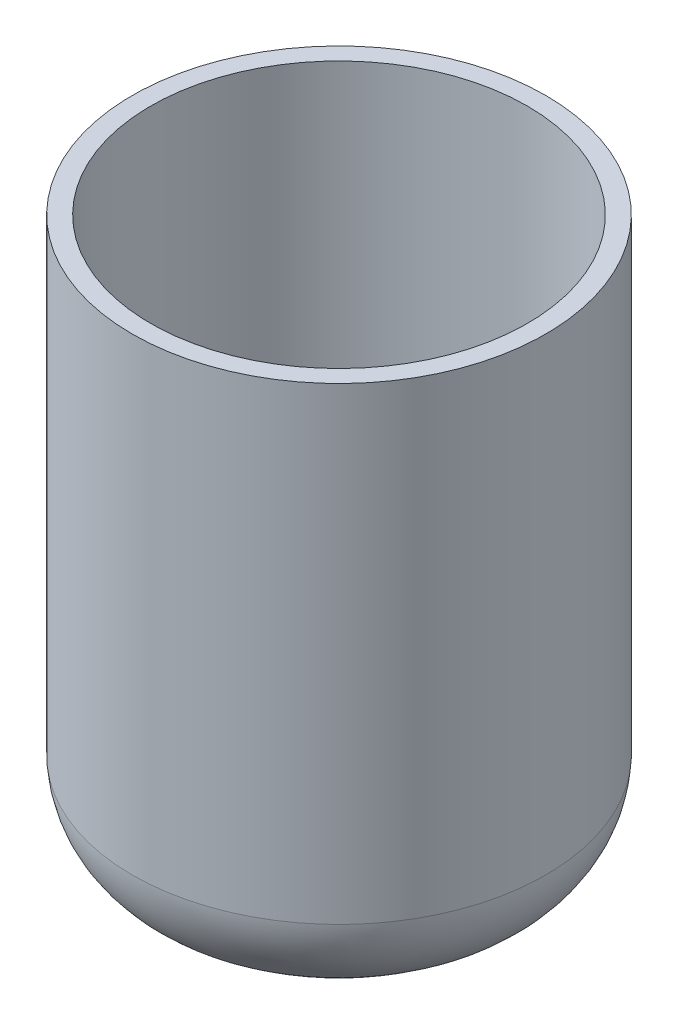
ISO-10303-21;
HEADER;
FILE_DESCRIPTION(('STEP AP214'),'2;1');
FILE_NAME('part.step','',(''),(''),'','','');
FILE_SCHEMA(('AUTOMOTIVE_DESIGN { 1 0 10303 214 1 1 1 1 }'));
ENDSEC;
DATA;
#1=APPLICATION_CONTEXT('core data for automotive mechanical design processes');
#2=APPLICATION_PROTOCOL_DEFINITION('international standard','automotive_design',2000,#1);
#3=PRODUCT_CONTEXT('',#1,'mechanical');
#4=PRODUCT('Part','Part','',(#3));
#5=PRODUCT_RELATED_PRODUCT_CATEGORY('part','',(#4));
#6=PRODUCT_DEFINITION_FORMATION('','',#4);
#7=PRODUCT_DEFINITION_CONTEXT('part definition',#1,'design');
#8=PRODUCT_DEFINITION('design','',#6,#7);
#9=PRODUCT_DEFINITION_SHAPE('','',#8);
#10=(LENGTH_UNIT() NAMED_UNIT(*) SI_UNIT(.MILLI.,.METRE.));
#11=(NAMED_UNIT(*) PLANE_ANGLE_UNIT() SI_UNIT($,.RADIAN.));
#12=(NAMED_UNIT(*) SI_UNIT($,.STERADIAN.) SOLID_ANGLE_UNIT());
#13=UNCERTAINTY_MEASURE_WITH_UNIT(LENGTH_MEASURE(1.E-05),#10,'distance_accuracy_value','');
#14=(GEOMETRIC_REPRESENTATION_CONTEXT(3) GLOBAL_UNCERTAINTY_ASSIGNED_CONTEXT((#13)) GLOBAL_UNIT_ASSIGNED_CONTEXT((#10,
#11,#12)) REPRESENTATION_CONTEXT('',''));
#15=CARTESIAN_POINT('',(0.,0.,0.));
#16=DIRECTION('',(0.,0.,1.));
#17=DIRECTION('',(1.,0.,0.));
#18=AXIS2_PLACEMENT_3D('',#15,#16,#17);
#19=CARTESIAN_POINT('',(145.,-590.,0.));
#20=DIRECTION('',(0.,1.,0.));
#21=DIRECTION('',(0.,0.,1.));
#22=AXIS2_PLACEMENT_3D('',#19,#20,#21);
#23=PLANE('',#22);
#24=CARTESIAN_POINT('',(0.,-590.,0.));
#25=DIRECTION('',(0.,-1.,0.));
#26=DIRECTION('',(0.,0.,-1.));
#27=AXIS2_PLACEMENT_3D('',#24,#25,#26);
#28=CIRCLE('',#27,142.122341448751);
#29=CARTESIAN_POINT('',(0.,-590.,-142.122341448751));
#30=VERTEX_POINT('',#29);
#31=EDGE_CURVE('E10',#30,#30,#28,.T.);
#32=ORIENTED_EDGE('',*,*,#31,.F.);
#33=EDGE_LOOP('',(#32));
#34=FACE_BOUND('',#33,.T.);
#35=ADVANCED_FACE('F34',(#34),#23,.T.);
#36=CARTESIAN_POINT('',(0.,-504.046103199423,0.));
#37=DIRECTION('',(0.,-1.,0.));
#38=DIRECTION('',(0.,0.,-1.));
#39=AXIS2_PLACEMENT_3D('',#36,#37,#38);
#40=TOROIDAL_SURFACE('',#39,115.440369542691,90.);
#41=ORIENTED_EDGE('',*,*,#31,.T.);
#42=EDGE_LOOP('',(#41));
#43=FACE_BOUND('',#42,.T.);
#44=CARTESIAN_POINT('',(0.,-509.896767872913,0.));
#45=DIRECTION('',(0.,-1.,0.));
#46=DIRECTION('',(0.,0.,-1.));
#47=AXIS2_PLACEMENT_3D('',#44,#45,#46);
#48=CIRCLE('',#47,205.25);
#49=CARTESIAN_POINT('',(0.,-509.896767872913,-205.25));
#50=VERTEX_POINT('',#49);
#51=EDGE_CURVE('E40',#50,#50,#48,.T.);
#52=ORIENTED_EDGE('',*,*,#51,.F.);
#53=EDGE_LOOP('',(#52));
#54=FACE_BOUND('',#53,.T.);
#55=ADVANCED_FACE('F82',(#43,#54),#40,.F.);
#56=CARTESIAN_POINT('',(0.,-610.,0.));
#57=DIRECTION('',(0.,-1.,0.));
#58=DIRECTION('',(0.,0.,-1.));
#59=AXIS2_PLACEMENT_3D('',#56,#57,#58);
#60=CYLINDRICAL_SURFACE('',#59,205.25);
#61=ORIENTED_EDGE('',*,*,#51,.T.);
#62=EDGE_LOOP('',(#61));
#63=FACE_BOUND('',#62,.T.);
#64=CARTESIAN_POINT('',(0.,0.,0.));
#65=DIRECTION('',(0.,-1.,0.));
#66=DIRECTION('',(0.,0.,-1.));
#67=AXIS2_PLACEMENT_3D('',#64,#65,#66);
#68=CIRCLE('',#67,205.25);
#69=CARTESIAN_POINT('',(0.,0.,-205.25));
#70=VERTEX_POINT('',#69);
#71=EDGE_CURVE('E44',#70,#70,#68,.T.);
#72=ORIENTED_EDGE('',*,*,#71,.F.);
#73=EDGE_LOOP('',(#72));
#74=FACE_BOUND('',#73,.T.);
#75=ADVANCED_FACE('F77',(#63,#74),#60,.F.);
#76=CARTESIAN_POINT('',(205.25,0.,0.));
#77=DIRECTION('',(0.,-1.,0.));
#78=DIRECTION('',(0.,0.,-1.));
#79=AXIS2_PLACEMENT_3D('',#76,#77,#78);
#80=PLANE('',#79);
#81=CARTESIAN_POINT('',(0.,0.,0.));
#82=DIRECTION('',(0.,-1.,0.));
#83=DIRECTION('',(0.,0.,-1.));
#84=AXIS2_PLACEMENT_3D('',#81,#82,#83);
#85=CIRCLE('',#84,225.25);
#86=CARTESIAN_POINT('',(0.,0.,-225.25));
#87=VERTEX_POINT('',#86);
#88=EDGE_CURVE('E48',#87,#87,#85,.T.);
#89=ORIENTED_EDGE('',*,*,#88,.F.);
#90=EDGE_LOOP('',(#89));
#91=FACE_BOUND('',#90,.T.);
#92=ORIENTED_EDGE('',*,*,#71,.T.);
#93=EDGE_LOOP('',(#92));
#94=FACE_BOUND('',#93,.T.);
#95=ADVANCED_FACE('F71',(#91,#94),#80,.F.);
#96=CARTESIAN_POINT('',(0.,-610.,0.));
#97=DIRECTION('',(0.,-1.,0.));
#98=DIRECTION('',(0.,0.,-1.));
#99=AXIS2_PLACEMENT_3D('',#96,#97,#98);
#100=CYLINDRICAL_SURFACE('',#99,225.25);
#101=CARTESIAN_POINT('',(0.,-510.514878881827,0.));
#102=DIRECTION('',(0.,-1.,0.));
#103=DIRECTION('',(0.,0.,-1.));
#104=AXIS2_PLACEMENT_3D('',#101,#102,#103);
#105=CIRCLE('',#104,225.25);
#106=CARTESIAN_POINT('',(0.,-510.514878881827,-225.25));
#107=VERTEX_POINT('',#106);
#108=EDGE_CURVE('E53',#107,#107,#105,.T.);
#109=ORIENTED_EDGE('',*,*,#108,.F.);
#110=EDGE_LOOP('',(#109));
#111=FACE_BOUND('',#110,.T.);
#112=ORIENTED_EDGE('',*,*,#88,.T.);
#113=EDGE_LOOP('',(#112));
#114=FACE_BOUND('',#113,.T.);
#115=ADVANCED_FACE('F65',(#111,#114),#100,.T.);
#116=CARTESIAN_POINT('',(0.,-504.046103199423,0.));
#117=DIRECTION('',(0.,-1.,0.));
#118=DIRECTION('',(0.,0.,-1.));
#119=AXIS2_PLACEMENT_3D('',#116,#117,#118);
#120=TOROIDAL_SURFACE('',#119,115.440369542691,110.);
#121=CARTESIAN_POINT('',(0.,-610.,0.));
#122=DIRECTION('',(0.,-1.,0.));
#123=DIRECTION('',(0.,0.,-1.));
#124=AXIS2_PLACEMENT_3D('',#121,#122,#123);
#125=CIRCLE('',#124,145.);
#126=CARTESIAN_POINT('',(0.,-610.,-145.));
#127=VERTEX_POINT('',#126);
#128=EDGE_CURVE('E56',#127,#127,#125,.T.);
#129=ORIENTED_EDGE('',*,*,#128,.F.);
#130=EDGE_LOOP('',(#129));
#131=FACE_BOUND('',#130,.T.);
#132=ORIENTED_EDGE('',*,*,#108,.T.);
#133=EDGE_LOOP('',(#132));
#134=FACE_BOUND('',#133,.T.);
#135=ADVANCED_FACE('F62',(#131,#134),#120,.T.);
#136=CARTESIAN_POINT('',(145.,-610.,0.));
#137=DIRECTION('',(0.,1.,0.));
#138=DIRECTION('',(0.,0.,1.));
#139=AXIS2_PLACEMENT_3D('',#136,#137,#138);
#140=PLANE('',#139);
#141=ORIENTED_EDGE('',*,*,#128,.T.);
#142=EDGE_LOOP('',(#141));
#143=FACE_BOUND('',#142,.T.);
#144=ADVANCED_FACE('F60',(#143),#140,.F.);
#145=CLOSED_SHELL('',(#35,#55,#75,#95,#115,#135,#144));
#146=MANIFOLD_SOLID_BREP('B2',#145);
#147=ADVANCED_BREP_SHAPE_REPRESENTATION('',(#18,#146),#14);
#148=SHAPE_DEFINITION_REPRESENTATION(#9,#147);
ENDSEC;
END-ISO-10303-21;
